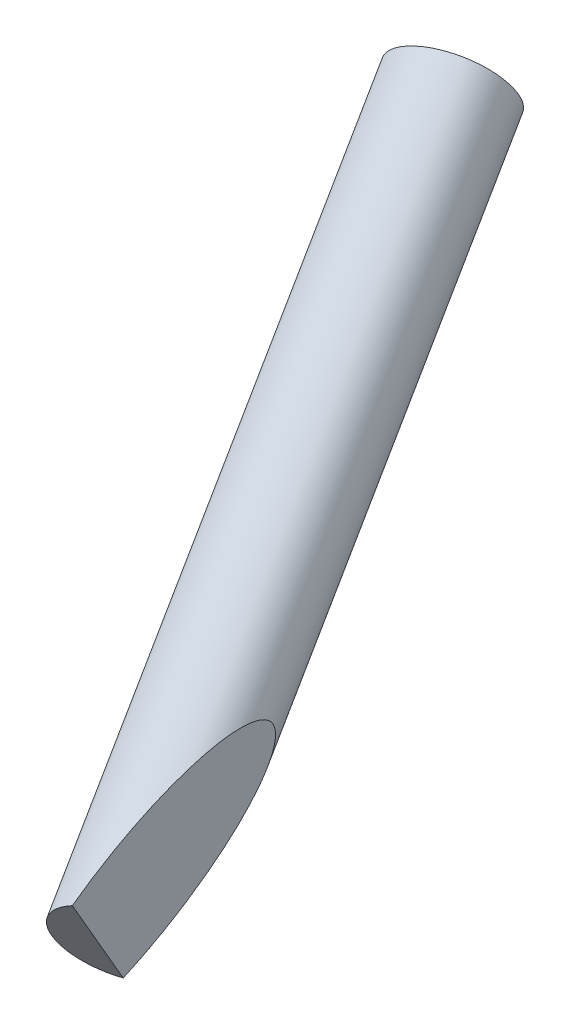
ISO-10303-21;
HEADER;
FILE_DESCRIPTION(('STEP AP214'),'2;1');
FILE_NAME('part.step','',(''),(''),'','','');
FILE_SCHEMA(('AUTOMOTIVE_DESIGN { 1 0 10303 214 1 1 1 1 }'));
ENDSEC;
DATA;
#1=APPLICATION_CONTEXT('core data for automotive mechanical design processes');
#2=APPLICATION_PROTOCOL_DEFINITION('international standard','automotive_design',2000,#1);
#3=PRODUCT_CONTEXT('',#1,'mechanical');
#4=PRODUCT('Part','Part','',(#3));
#5=PRODUCT_RELATED_PRODUCT_CATEGORY('part','',(#4));
#6=PRODUCT_DEFINITION_FORMATION('','',#4);
#7=PRODUCT_DEFINITION_CONTEXT('part definition',#1,'design');
#8=PRODUCT_DEFINITION('design','',#6,#7);
#9=PRODUCT_DEFINITION_SHAPE('','',#8);
#10=(LENGTH_UNIT() NAMED_UNIT(*) SI_UNIT(.MILLI.,.METRE.));
#11=(NAMED_UNIT(*) PLANE_ANGLE_UNIT() SI_UNIT($,.RADIAN.));
#12=(NAMED_UNIT(*) SI_UNIT($,.STERADIAN.) SOLID_ANGLE_UNIT());
#13=UNCERTAINTY_MEASURE_WITH_UNIT(LENGTH_MEASURE(1.E-05),#10,'distance_accuracy_value','');
#14=(GEOMETRIC_REPRESENTATION_CONTEXT(3) GLOBAL_UNCERTAINTY_ASSIGNED_CONTEXT((#13)) GLOBAL_UNIT_ASSIGNED_CONTEXT((#10,
#11,#12)) REPRESENTATION_CONTEXT('',''));
#15=CARTESIAN_POINT('',(0.,0.,0.));
#16=DIRECTION('',(0.,0.,1.));
#17=DIRECTION('',(1.,0.,0.));
#18=AXIS2_PLACEMENT_3D('',#15,#16,#17);
#19=CARTESIAN_POINT('',(-78.9999999999968,724.786056934811,-427.366603945695));
#20=DIRECTION('',(-1.,0.,0.));
#21=DIRECTION('',(0.,0.,1.));
#22=AXIS2_PLACEMENT_3D('',#19,#20,#21);
#23=PLANE('',#22);
#24=CARTESIAN_POINT('',(-78.9999999999968,720.664840805629,-420.22844822098));
#25=DIRECTION('',(-1.,0.,0.));
#26=DIRECTION('',(0.,-0.500000000000042,0.866025403784414));
#27=AXIS2_PLACEMENT_3D('',#24,#25,#26);
#28=ELLIPSE('',#27,4.38570660024477,1.5);
#29=CARTESIAN_POINT('',(-78.9999999999967,721.251095156231,-418.380278488425));
#30=VERTEX_POINT('',#29);
#31=CARTESIAN_POINT('',(-78.9999999999967,718.77115169143,-419.812074515403));
#32=VERTEX_POINT('',#31);
#33=EDGE_CURVE('E20',#30,#32,#28,.T.);
#34=ORIENTED_EDGE('',*,*,#33,.F.);
#35=DIRECTION('',(0.,-0.866025403784414,-0.500000000000043));
#36=VECTOR('',#35,1.);
#37=CARTESIAN_POINT('',(-78.9999999999967,720.01112342383,-419.096176501914));
#38=LINE('',#37,#36);
#39=EDGE_CURVE('E36',#32,#30,#38,.F.);
#40=ORIENTED_EDGE('',*,*,#39,.F.);
#41=EDGE_LOOP('',(#34,#40));
#42=FACE_BOUND('',#41,.T.);
#43=ADVANCED_FACE('F17',(#42),#23,.F.);
#44=CARTESIAN_POINT('',(-85.4202014332536,729.484520038741,-435.504580759188));
#45=DIRECTION('',(-0.342020143325658,0.469846310392996,-0.813797681349354));
#46=DIRECTION('',(0.,0.866025403784414,0.500000000000043));
#47=AXIS2_PLACEMENT_3D('',#44,#45,#46);
#48=PLANE('',#47);
#49=CARTESIAN_POINT('',(-85.4202014332533,729.484520038741,-435.504580759188));
#50=DIRECTION('',(0.342020143325658,-0.469846310392996,0.813797681349354));
#51=DIRECTION('',(0.,-0.866025403784414,-0.500000000000043));
#52=AXIS2_PLACEMENT_3D('',#49,#50,#51);
#53=CIRCLE('',#52,1.5);
#54=CARTESIAN_POINT('',(-85.4202014332533,728.185481933064,-436.254580759188));
#55=VERTEX_POINT('',#54);
#56=EDGE_CURVE('E25',#55,#55,#53,.T.);
#57=ORIENTED_EDGE('',*,*,#56,.F.);
#58=EDGE_LOOP('',(#57));
#59=FACE_BOUND('',#58,.T.);
#60=ADVANCED_FACE('F41',(#59),#48,.T.);
#61=CARTESIAN_POINT('',(-78.57979856674,720.087593830881,-419.228627132201));
#62=DIRECTION('',(0.342020143325658,-0.469846310392996,0.813797681349354));
#63=DIRECTION('',(0.,-0.866025403784414,-0.500000000000043));
#64=AXIS2_PLACEMENT_3D('',#61,#62,#63);
#65=PLANE('',#64);
#66=ORIENTED_EDGE('',*,*,#39,.T.);
#67=CARTESIAN_POINT('',(-78.5797985667401,720.087593830881,-419.228627132201));
#68=DIRECTION('',(0.342020143325658,-0.469846310392996,0.813797681349354));
#69=DIRECTION('',(0.,-0.866025403784414,-0.500000000000043));
#70=AXIS2_PLACEMENT_3D('',#67,#68,#69);
#71=CIRCLE('',#70,1.5);
#72=EDGE_CURVE('E11',#32,#30,#71,.F.);
#73=ORIENTED_EDGE('',*,*,#72,.F.);
#74=EDGE_LOOP('',(#66,#73));
#75=FACE_BOUND('',#74,.T.);
#76=ADVANCED_FACE('F39',(#75),#65,.T.);
#77=CARTESIAN_POINT('',(-80.2898992833684,722.436825382846,-423.297615538948));
#78=DIRECTION('',(0.342020143325658,-0.469846310392996,0.813797681349354));
#79=DIRECTION('',(0.,-0.866025403784414,-0.500000000000043));
#80=AXIS2_PLACEMENT_3D('',#77,#78,#79);
#81=CYLINDRICAL_SURFACE('',#80,1.5);
#82=ORIENTED_EDGE('',*,*,#56,.T.);
#83=EDGE_LOOP('',(#82));
#84=FACE_BOUND('',#83,.T.);
#85=ORIENTED_EDGE('',*,*,#72,.T.);
#86=ORIENTED_EDGE('',*,*,#33,.T.);
#87=EDGE_LOOP('',(#85,#86));
#88=FACE_BOUND('',#87,.T.);
#89=ADVANCED_FACE('F34',(#84,#88),#81,.T.);
#90=CLOSED_SHELL('',(#43,#60,#76,#89));
#91=MANIFOLD_SOLID_BREP('B1',#90);
#92=ADVANCED_BREP_SHAPE_REPRESENTATION('',(#18,#91),#14);
#93=SHAPE_DEFINITION_REPRESENTATION(#9,#92);
ENDSEC;
END-ISO-10303-21;
